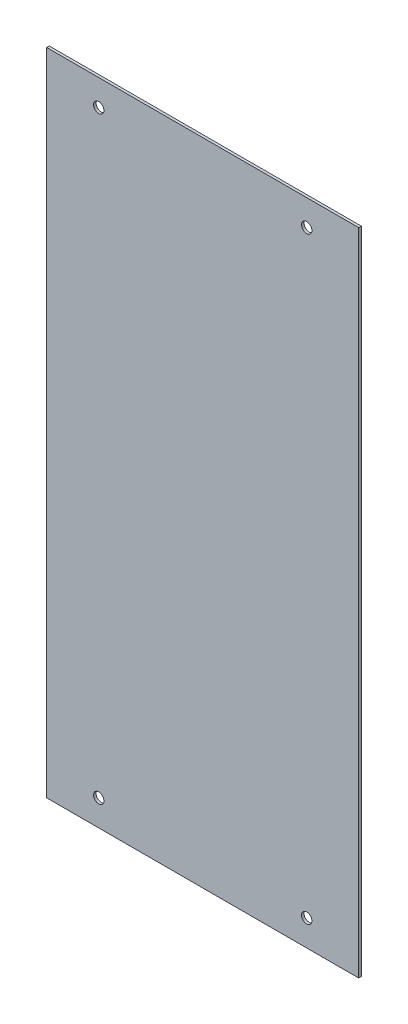
ISO-10303-21;
HEADER;
FILE_DESCRIPTION(('STEP AP214'),'2;1');
FILE_NAME('part.step','',(''),(''),'','','');
FILE_SCHEMA(('AUTOMOTIVE_DESIGN { 1 0 10303 214 1 1 1 1 }'));
ENDSEC;
DATA;
#1=APPLICATION_CONTEXT('core data for automotive mechanical design processes');
#2=APPLICATION_PROTOCOL_DEFINITION('international standard','automotive_design',2000,#1);
#3=PRODUCT_CONTEXT('',#1,'mechanical');
#4=PRODUCT('Part','Part','',(#3));
#5=PRODUCT_RELATED_PRODUCT_CATEGORY('part','',(#4));
#6=PRODUCT_DEFINITION_FORMATION('','',#4);
#7=PRODUCT_DEFINITION_CONTEXT('part definition',#1,'design');
#8=PRODUCT_DEFINITION('design','',#6,#7);
#9=PRODUCT_DEFINITION_SHAPE('','',#8);
#10=(LENGTH_UNIT() NAMED_UNIT(*) SI_UNIT(.MILLI.,.METRE.));
#11=(NAMED_UNIT(*) PLANE_ANGLE_UNIT() SI_UNIT($,.RADIAN.));
#12=(NAMED_UNIT(*) SI_UNIT($,.STERADIAN.) SOLID_ANGLE_UNIT());
#13=UNCERTAINTY_MEASURE_WITH_UNIT(LENGTH_MEASURE(1.E-05),#10,'distance_accuracy_value','');
#14=(GEOMETRIC_REPRESENTATION_CONTEXT(3) GLOBAL_UNCERTAINTY_ASSIGNED_CONTEXT((#13)) GLOBAL_UNIT_ASSIGNED_CONTEXT((#10,
#11,#12)) REPRESENTATION_CONTEXT('',''));
#15=CARTESIAN_POINT('',(0.,0.,0.));
#16=DIRECTION('',(0.,0.,1.));
#17=DIRECTION('',(1.,0.,0.));
#18=AXIS2_PLACEMENT_3D('',#15,#16,#17);
#19=CARTESIAN_POINT('',(0.,0.,1.));
#20=DIRECTION('',(0.,0.,-1.));
#21=DIRECTION('',(-1.,0.,0.));
#22=AXIS2_PLACEMENT_3D('',#19,#20,#21);
#23=PLANE('',#22);
#24=DIRECTION('',(0.,-1.,0.));
#25=VECTOR('',#24,1.);
#26=CARTESIAN_POINT('',(0.,0.,1.));
#27=LINE('',#26,#25);
#28=CARTESIAN_POINT('',(0.,250.,1.));
#29=VERTEX_POINT('',#28);
#30=CARTESIAN_POINT('',(0.,0.,1.));
#31=VERTEX_POINT('',#30);
#32=EDGE_CURVE('E96',#29,#31,#27,.T.);
#33=ORIENTED_EDGE('',*,*,#32,.T.);
#34=DIRECTION('',(1.,0.,0.));
#35=VECTOR('',#34,1.);
#36=CARTESIAN_POINT('',(0.,0.,1.));
#37=LINE('',#36,#35);
#38=CARTESIAN_POINT('',(120.,0.,1.));
#39=VERTEX_POINT('',#38);
#40=EDGE_CURVE('E91',#31,#39,#37,.T.);
#41=ORIENTED_EDGE('',*,*,#40,.T.);
#42=DIRECTION('',(0.,1.,0.));
#43=VECTOR('',#42,1.);
#44=CARTESIAN_POINT('',(120.,0.,1.));
#45=LINE('',#44,#43);
#46=CARTESIAN_POINT('',(120.,250.,1.));
#47=VERTEX_POINT('',#46);
#48=EDGE_CURVE('E94',#39,#47,#45,.T.);
#49=ORIENTED_EDGE('',*,*,#48,.T.);
#50=DIRECTION('',(-1.,0.,0.));
#51=VECTOR('',#50,1.);
#52=CARTESIAN_POINT('',(0.,250.,1.));
#53=LINE('',#52,#51);
#54=EDGE_CURVE('E61',#47,#29,#53,.T.);
#55=ORIENTED_EDGE('',*,*,#54,.T.);
#56=EDGE_LOOP('',(#33,#41,#49,#55));
#57=FACE_BOUND('',#56,.T.);
#58=CARTESIAN_POINT('',(20.,240.,1.));
#59=DIRECTION('',(0.,0.,1.));
#60=DIRECTION('',(1.,0.,0.));
#61=AXIS2_PLACEMENT_3D('',#58,#59,#60);
#62=CIRCLE('',#61,2.);
#63=CARTESIAN_POINT('',(22.,240.,1.));
#64=VERTEX_POINT('',#63);
#65=EDGE_CURVE('E116',#64,#64,#62,.T.);
#66=ORIENTED_EDGE('',*,*,#65,.F.);
#67=EDGE_LOOP('',(#66));
#68=FACE_BOUND('',#67,.T.);
#69=CARTESIAN_POINT('',(100.,240.,1.));
#70=DIRECTION('',(0.,0.,1.));
#71=DIRECTION('',(1.,0.,0.));
#72=AXIS2_PLACEMENT_3D('',#69,#70,#71);
#73=CIRCLE('',#72,2.);
#74=CARTESIAN_POINT('',(102.,240.,1.));
#75=VERTEX_POINT('',#74);
#76=EDGE_CURVE('E138',#75,#75,#73,.T.);
#77=ORIENTED_EDGE('',*,*,#76,.F.);
#78=EDGE_LOOP('',(#77));
#79=FACE_BOUND('',#78,.T.);
#80=CARTESIAN_POINT('',(100.,10.,1.));
#81=DIRECTION('',(0.,0.,1.));
#82=DIRECTION('',(1.,0.,0.));
#83=AXIS2_PLACEMENT_3D('',#80,#81,#82);
#84=CIRCLE('',#83,2.);
#85=CARTESIAN_POINT('',(102.,10.,1.));
#86=VERTEX_POINT('',#85);
#87=EDGE_CURVE('E146',#86,#86,#84,.T.);
#88=ORIENTED_EDGE('',*,*,#87,.F.);
#89=EDGE_LOOP('',(#88));
#90=FACE_BOUND('',#89,.T.);
#91=CARTESIAN_POINT('',(20.,10.,1.));
#92=DIRECTION('',(0.,0.,1.));
#93=DIRECTION('',(1.,0.,0.));
#94=AXIS2_PLACEMENT_3D('',#91,#92,#93);
#95=CIRCLE('',#94,2.);
#96=CARTESIAN_POINT('',(22.,10.,1.));
#97=VERTEX_POINT('',#96);
#98=EDGE_CURVE('E154',#97,#97,#95,.T.);
#99=ORIENTED_EDGE('',*,*,#98,.F.);
#100=EDGE_LOOP('',(#99));
#101=FACE_BOUND('',#100,.T.);
#102=ADVANCED_FACE('F43',(#57,#68,#79,#90,#101),#23,.F.);
#103=CARTESIAN_POINT('',(0.,0.,0.));
#104=DIRECTION('',(0.,0.,-1.));
#105=DIRECTION('',(-1.,0.,0.));
#106=AXIS2_PLACEMENT_3D('',#103,#104,#105);
#107=PLANE('',#106);
#108=CARTESIAN_POINT('',(100.,10.,0.));
#109=DIRECTION('',(0.,0.,1.));
#110=DIRECTION('',(1.,0.,0.));
#111=AXIS2_PLACEMENT_3D('',#108,#109,#110);
#112=CIRCLE('',#111,2.);
#113=CARTESIAN_POINT('',(102.,10.,0.));
#114=VERTEX_POINT('',#113);
#115=EDGE_CURVE('E150',#114,#114,#112,.T.);
#116=ORIENTED_EDGE('',*,*,#115,.T.);
#117=EDGE_LOOP('',(#116));
#118=FACE_BOUND('',#117,.T.);
#119=CARTESIAN_POINT('',(20.,240.,0.));
#120=DIRECTION('',(0.,0.,1.));
#121=DIRECTION('',(1.,0.,0.));
#122=AXIS2_PLACEMENT_3D('',#119,#120,#121);
#123=CIRCLE('',#122,2.);
#124=CARTESIAN_POINT('',(22.,240.,0.));
#125=VERTEX_POINT('',#124);
#126=EDGE_CURVE('E134',#125,#125,#123,.T.);
#127=ORIENTED_EDGE('',*,*,#126,.T.);
#128=EDGE_LOOP('',(#127));
#129=FACE_BOUND('',#128,.T.);
#130=DIRECTION('',(0.,-1.,0.));
#131=VECTOR('',#130,1.);
#132=CARTESIAN_POINT('',(0.,0.,0.));
#133=LINE('',#132,#131);
#134=CARTESIAN_POINT('',(0.,250.,0.));
#135=VERTEX_POINT('',#134);
#136=CARTESIAN_POINT('',(0.,0.,0.));
#137=VERTEX_POINT('',#136);
#138=EDGE_CURVE('E112',#135,#137,#133,.T.);
#139=ORIENTED_EDGE('',*,*,#138,.F.);
#140=DIRECTION('',(-1.,0.,0.));
#141=VECTOR('',#140,1.);
#142=CARTESIAN_POINT('',(0.,250.,0.));
#143=LINE('',#142,#141);
#144=CARTESIAN_POINT('',(120.,250.,0.));
#145=VERTEX_POINT('',#144);
#146=EDGE_CURVE('E84',#145,#135,#143,.T.);
#147=ORIENTED_EDGE('',*,*,#146,.F.);
#148=DIRECTION('',(0.,1.,0.));
#149=VECTOR('',#148,1.);
#150=CARTESIAN_POINT('',(120.,0.,0.));
#151=LINE('',#150,#149);
#152=CARTESIAN_POINT('',(120.,0.,0.));
#153=VERTEX_POINT('',#152);
#154=EDGE_CURVE('E78',#153,#145,#151,.T.);
#155=ORIENTED_EDGE('',*,*,#154,.F.);
#156=DIRECTION('',(1.,0.,0.));
#157=VECTOR('',#156,1.);
#158=CARTESIAN_POINT('',(0.,0.,0.));
#159=LINE('',#158,#157);
#160=EDGE_CURVE('E101',#137,#153,#159,.T.);
#161=ORIENTED_EDGE('',*,*,#160,.F.);
#162=EDGE_LOOP('',(#139,#147,#155,#161));
#163=FACE_BOUND('',#162,.T.);
#164=CARTESIAN_POINT('',(100.,240.,0.));
#165=DIRECTION('',(0.,0.,1.));
#166=DIRECTION('',(1.,0.,0.));
#167=AXIS2_PLACEMENT_3D('',#164,#165,#166);
#168=CIRCLE('',#167,2.);
#169=CARTESIAN_POINT('',(102.,240.,0.));
#170=VERTEX_POINT('',#169);
#171=EDGE_CURVE('E142',#170,#170,#168,.T.);
#172=ORIENTED_EDGE('',*,*,#171,.T.);
#173=EDGE_LOOP('',(#172));
#174=FACE_BOUND('',#173,.T.);
#175=CARTESIAN_POINT('',(20.,10.,0.));
#176=DIRECTION('',(0.,0.,1.));
#177=DIRECTION('',(1.,0.,0.));
#178=AXIS2_PLACEMENT_3D('',#175,#176,#177);
#179=CIRCLE('',#178,2.);
#180=CARTESIAN_POINT('',(22.,10.,0.));
#181=VERTEX_POINT('',#180);
#182=EDGE_CURVE('E158',#181,#181,#179,.T.);
#183=ORIENTED_EDGE('',*,*,#182,.T.);
#184=EDGE_LOOP('',(#183));
#185=FACE_BOUND('',#184,.T.);
#186=ADVANCED_FACE('F129',(#118,#129,#163,#174,#185),#107,.T.);
#187=CARTESIAN_POINT('',(0.,0.,1.));
#188=DIRECTION('',(1.,0.,0.));
#189=DIRECTION('',(0.,0.,-1.));
#190=AXIS2_PLACEMENT_3D('',#187,#188,#189);
#191=PLANE('',#190);
#192=ORIENTED_EDGE('',*,*,#138,.T.);
#193=DIRECTION('',(0.,0.,-1.));
#194=VECTOR('',#193,1.);
#195=CARTESIAN_POINT('',(0.,0.,1.));
#196=LINE('',#195,#194);
#197=EDGE_CURVE('E11',#31,#137,#196,.T.);
#198=ORIENTED_EDGE('',*,*,#197,.F.);
#199=ORIENTED_EDGE('',*,*,#32,.F.);
#200=DIRECTION('',(0.,0.,-1.));
#201=VECTOR('',#200,1.);
#202=CARTESIAN_POINT('',(0.,250.,1.));
#203=LINE('',#202,#201);
#204=EDGE_CURVE('E108',#29,#135,#203,.T.);
#205=ORIENTED_EDGE('',*,*,#204,.T.);
#206=EDGE_LOOP('',(#192,#198,#199,#205));
#207=FACE_BOUND('',#206,.T.);
#208=ADVANCED_FACE('F45',(#207),#191,.F.);
#209=CARTESIAN_POINT('',(0.,0.,1.));
#210=DIRECTION('',(0.,1.,0.));
#211=DIRECTION('',(0.,0.,1.));
#212=AXIS2_PLACEMENT_3D('',#209,#210,#211);
#213=PLANE('',#212);
#214=ORIENTED_EDGE('',*,*,#160,.T.);
#215=DIRECTION('',(0.,0.,-1.));
#216=VECTOR('',#215,1.);
#217=CARTESIAN_POINT('',(120.,0.,1.));
#218=LINE('',#217,#216);
#219=EDGE_CURVE('E53',#39,#153,#218,.T.);
#220=ORIENTED_EDGE('',*,*,#219,.F.);
#221=ORIENTED_EDGE('',*,*,#40,.F.);
#222=ORIENTED_EDGE('',*,*,#197,.T.);
#223=EDGE_LOOP('',(#214,#220,#221,#222));
#224=FACE_BOUND('',#223,.T.);
#225=ADVANCED_FACE('F100',(#224),#213,.F.);
#226=CARTESIAN_POINT('',(120.,0.,1.));
#227=DIRECTION('',(-1.,0.,0.));
#228=DIRECTION('',(0.,0.,1.));
#229=AXIS2_PLACEMENT_3D('',#226,#227,#228);
#230=PLANE('',#229);
#231=ORIENTED_EDGE('',*,*,#154,.T.);
#232=DIRECTION('',(0.,0.,-1.));
#233=VECTOR('',#232,1.);
#234=CARTESIAN_POINT('',(120.,250.,1.));
#235=LINE('',#234,#233);
#236=EDGE_CURVE('E103',#47,#145,#235,.T.);
#237=ORIENTED_EDGE('',*,*,#236,.F.);
#238=ORIENTED_EDGE('',*,*,#48,.F.);
#239=ORIENTED_EDGE('',*,*,#219,.T.);
#240=EDGE_LOOP('',(#231,#237,#238,#239));
#241=FACE_BOUND('',#240,.T.);
#242=ADVANCED_FACE('F104',(#241),#230,.F.);
#243=CARTESIAN_POINT('',(0.,250.,1.));
#244=DIRECTION('',(0.,-1.,0.));
#245=DIRECTION('',(0.,0.,-1.));
#246=AXIS2_PLACEMENT_3D('',#243,#244,#245);
#247=PLANE('',#246);
#248=ORIENTED_EDGE('',*,*,#146,.T.);
#249=ORIENTED_EDGE('',*,*,#204,.F.);
#250=ORIENTED_EDGE('',*,*,#54,.F.);
#251=ORIENTED_EDGE('',*,*,#236,.T.);
#252=EDGE_LOOP('',(#248,#249,#250,#251));
#253=FACE_BOUND('',#252,.T.);
#254=ADVANCED_FACE('F126',(#253),#247,.F.);
#255=CARTESIAN_POINT('',(20.,240.,1.));
#256=DIRECTION('',(0.,0.,-1.));
#257=DIRECTION('',(-1.,0.,0.));
#258=AXIS2_PLACEMENT_3D('',#255,#256,#257);
#259=CYLINDRICAL_SURFACE('',#258,2.);
#260=ORIENTED_EDGE('',*,*,#65,.T.);
#261=EDGE_LOOP('',(#260));
#262=FACE_BOUND('',#261,.T.);
#263=ORIENTED_EDGE('',*,*,#126,.F.);
#264=EDGE_LOOP('',(#263));
#265=FACE_BOUND('',#264,.T.);
#266=ADVANCED_FACE('F177',(#262,#265),#259,.F.);
#267=CARTESIAN_POINT('',(100.,240.,1.));
#268=DIRECTION('',(0.,0.,-1.));
#269=DIRECTION('',(-1.,0.,0.));
#270=AXIS2_PLACEMENT_3D('',#267,#268,#269);
#271=CYLINDRICAL_SURFACE('',#270,2.);
#272=ORIENTED_EDGE('',*,*,#76,.T.);
#273=EDGE_LOOP('',(#272));
#274=FACE_BOUND('',#273,.T.);
#275=ORIENTED_EDGE('',*,*,#171,.F.);
#276=EDGE_LOOP('',(#275));
#277=FACE_BOUND('',#276,.T.);
#278=ADVANCED_FACE('F231',(#274,#277),#271,.F.);
#279=CARTESIAN_POINT('',(100.,10.,1.));
#280=DIRECTION('',(0.,0.,-1.));
#281=DIRECTION('',(-1.,0.,0.));
#282=AXIS2_PLACEMENT_3D('',#279,#280,#281);
#283=CYLINDRICAL_SURFACE('',#282,2.);
#284=ORIENTED_EDGE('',*,*,#87,.T.);
#285=EDGE_LOOP('',(#284));
#286=FACE_BOUND('',#285,.T.);
#287=ORIENTED_EDGE('',*,*,#115,.F.);
#288=EDGE_LOOP('',(#287));
#289=FACE_BOUND('',#288,.T.);
#290=ADVANCED_FACE('F240',(#286,#289),#283,.F.);
#291=CARTESIAN_POINT('',(20.,10.,1.));
#292=DIRECTION('',(0.,0.,-1.));
#293=DIRECTION('',(-1.,0.,0.));
#294=AXIS2_PLACEMENT_3D('',#291,#292,#293);
#295=CYLINDRICAL_SURFACE('',#294,2.);
#296=ORIENTED_EDGE('',*,*,#98,.T.);
#297=EDGE_LOOP('',(#296));
#298=FACE_BOUND('',#297,.T.);
#299=ORIENTED_EDGE('',*,*,#182,.F.);
#300=EDGE_LOOP('',(#299));
#301=FACE_BOUND('',#300,.T.);
#302=ADVANCED_FACE('F166',(#298,#301),#295,.F.);
#303=CLOSED_SHELL('',(#102,#186,#208,#225,#242,#254,#266,#278,#290,#302));
#304=MANIFOLD_SOLID_BREP('B2',#303);
#305=ADVANCED_BREP_SHAPE_REPRESENTATION('',(#18,#304),#14);
#306=SHAPE_DEFINITION_REPRESENTATION(#9,#305);
ENDSEC;
END-ISO-10303-21;
